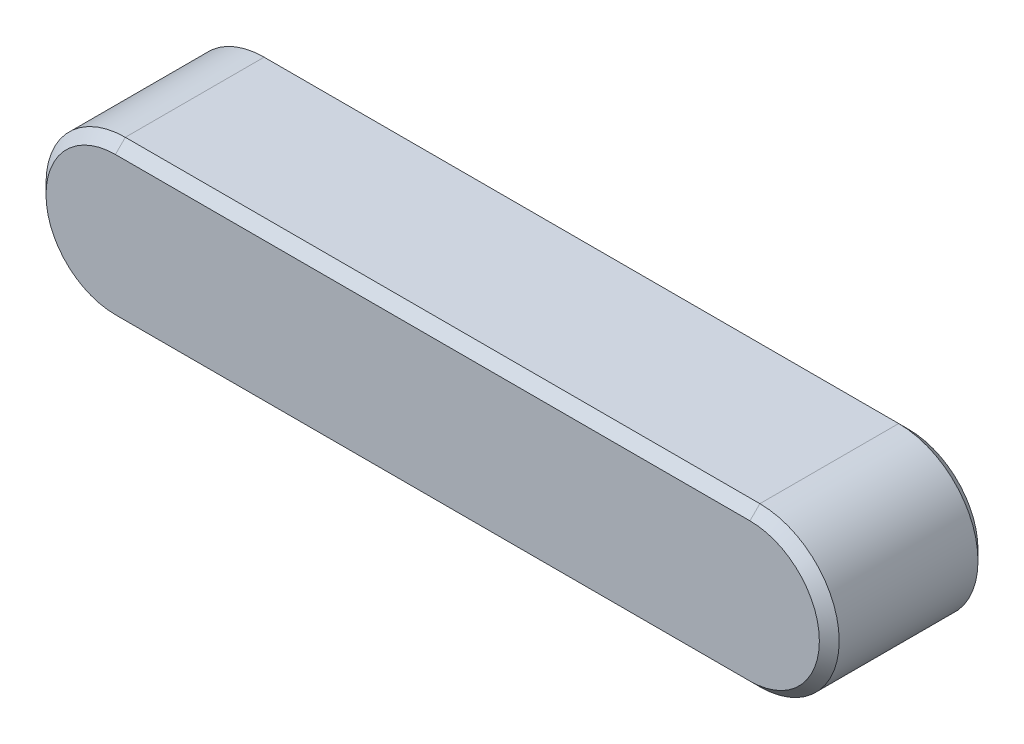
ISO-10303-21;
HEADER;
FILE_DESCRIPTION(('STEP AP214'),'2;1');
FILE_NAME('part.step','',(''),(''),'','','');
FILE_SCHEMA(('AUTOMOTIVE_DESIGN { 1 0 10303 214 1 1 1 1 }'));
ENDSEC;
DATA;
#1=APPLICATION_CONTEXT('core data for automotive mechanical design processes');
#2=APPLICATION_PROTOCOL_DEFINITION('international standard','automotive_design',2000,#1);
#3=PRODUCT_CONTEXT('',#1,'mechanical');
#4=PRODUCT('Part','Part','',(#3));
#5=PRODUCT_RELATED_PRODUCT_CATEGORY('part','',(#4));
#6=PRODUCT_DEFINITION_FORMATION('','',#4);
#7=PRODUCT_DEFINITION_CONTEXT('part definition',#1,'design');
#8=PRODUCT_DEFINITION('design','',#6,#7);
#9=PRODUCT_DEFINITION_SHAPE('','',#8);
#10=(LENGTH_UNIT() NAMED_UNIT(*) SI_UNIT(.MILLI.,.METRE.));
#11=(NAMED_UNIT(*) PLANE_ANGLE_UNIT() SI_UNIT($,.RADIAN.));
#12=(NAMED_UNIT(*) SI_UNIT($,.STERADIAN.) SOLID_ANGLE_UNIT());
#13=UNCERTAINTY_MEASURE_WITH_UNIT(LENGTH_MEASURE(1.E-05),#10,'distance_accuracy_value','');
#14=(GEOMETRIC_REPRESENTATION_CONTEXT(3) GLOBAL_UNCERTAINTY_ASSIGNED_CONTEXT((#13)) GLOBAL_UNIT_ASSIGNED_CONTEXT((#10,
#11,#12)) REPRESENTATION_CONTEXT('',''));
#15=CARTESIAN_POINT('',(0.,0.,0.));
#16=DIRECTION('',(0.,0.,1.));
#17=DIRECTION('',(1.,0.,0.));
#18=AXIS2_PLACEMENT_3D('',#15,#16,#17);
#19=CARTESIAN_POINT('',(-16.,0.,2.));
#20=DIRECTION('',(0.,0.,-1.));
#21=DIRECTION('',(-1.,0.,0.));
#22=AXIS2_PLACEMENT_3D('',#19,#20,#21);
#23=CYLINDRICAL_SURFACE('',#22,2.);
#24=DIRECTION('',(0.,0.,-1.));
#25=VECTOR('',#24,1.);
#26=CARTESIAN_POINT('',(-16.,-2.,2.));
#27=LINE('',#26,#25);
#28=CARTESIAN_POINT('',(-16.,-2.,1.75));
#29=VERTEX_POINT('',#28);
#30=CARTESIAN_POINT('',(-16.,-2.,-1.75));
#31=VERTEX_POINT('',#30);
#32=EDGE_CURVE('E120',#29,#31,#27,.T.);
#33=ORIENTED_EDGE('',*,*,#32,.F.);
#34=CARTESIAN_POINT('',(-16.,0.,1.75));
#35=DIRECTION('',(0.,0.,-1.));
#36=DIRECTION('',(-1.,0.,0.));
#37=AXIS2_PLACEMENT_3D('',#34,#35,#36);
#38=CIRCLE('',#37,2.);
#39=CARTESIAN_POINT('',(-16.,2.,1.75));
#40=VERTEX_POINT('',#39);
#41=EDGE_CURVE('E54',#29,#40,#38,.T.);
#42=ORIENTED_EDGE('',*,*,#41,.T.);
#43=DIRECTION('',(0.,0.,-1.));
#44=VECTOR('',#43,1.);
#45=CARTESIAN_POINT('',(-16.,2.,2.));
#46=LINE('',#45,#44);
#47=CARTESIAN_POINT('',(-16.,2.,-1.75));
#48=VERTEX_POINT('',#47);
#49=EDGE_CURVE('E158',#40,#48,#46,.T.);
#50=ORIENTED_EDGE('',*,*,#49,.T.);
#51=CARTESIAN_POINT('',(-16.,0.,-1.75));
#52=DIRECTION('',(0.,0.,-1.));
#53=DIRECTION('',(-1.,0.,0.));
#54=AXIS2_PLACEMENT_3D('',#51,#52,#53);
#55=CIRCLE('',#54,2.);
#56=EDGE_CURVE('E108',#48,#31,#55,.F.);
#57=ORIENTED_EDGE('',*,*,#56,.T.);
#58=EDGE_LOOP('',(#33,#42,#50,#57));
#59=FACE_BOUND('',#58,.T.);
#60=ADVANCED_FACE('F31',(#59),#23,.T.);
#61=CARTESIAN_POINT('',(0.,-2.,2.));
#62=DIRECTION('',(0.,1.,0.));
#63=DIRECTION('',(-1.,0.,0.));
#64=AXIS2_PLACEMENT_3D('',#61,#62,#63);
#65=PLANE('',#64);
#66=ORIENTED_EDGE('',*,*,#32,.T.);
#67=DIRECTION('',(1.,0.,0.));
#68=VECTOR('',#67,1.);
#69=CARTESIAN_POINT('',(0.,-2.,-1.75));
#70=LINE('',#69,#68);
#71=CARTESIAN_POINT('',(0.,-2.,-1.75));
#72=VERTEX_POINT('',#71);
#73=EDGE_CURVE('E119',#31,#72,#70,.T.);
#74=ORIENTED_EDGE('',*,*,#73,.T.);
#75=DIRECTION('',(0.,0.,-1.));
#76=VECTOR('',#75,1.);
#77=CARTESIAN_POINT('',(0.,-2.,2.));
#78=LINE('',#77,#76);
#79=CARTESIAN_POINT('',(0.,-2.,1.75));
#80=VERTEX_POINT('',#79);
#81=EDGE_CURVE('E102',#80,#72,#78,.T.);
#82=ORIENTED_EDGE('',*,*,#81,.F.);
#83=DIRECTION('',(-1.,0.,0.));
#84=VECTOR('',#83,1.);
#85=CARTESIAN_POINT('',(0.,-2.,1.74999999999999));
#86=LINE('',#85,#84);
#87=EDGE_CURVE('E117',#80,#29,#86,.T.);
#88=ORIENTED_EDGE('',*,*,#87,.T.);
#89=EDGE_LOOP('',(#66,#74,#82,#88));
#90=FACE_BOUND('',#89,.T.);
#91=ADVANCED_FACE('F116',(#90),#65,.F.);
#92=CARTESIAN_POINT('',(0.,0.,2.));
#93=DIRECTION('',(0.,0.,-1.));
#94=DIRECTION('',(-1.,0.,0.));
#95=AXIS2_PLACEMENT_3D('',#92,#93,#94);
#96=CYLINDRICAL_SURFACE('',#95,2.);
#97=DIRECTION('',(0.,0.,-1.));
#98=VECTOR('',#97,1.);
#99=CARTESIAN_POINT('',(0.,2.,2.));
#100=LINE('',#99,#98);
#101=CARTESIAN_POINT('',(0.,2.,1.75));
#102=VERTEX_POINT('',#101);
#103=CARTESIAN_POINT('',(0.,2.,-1.75));
#104=VERTEX_POINT('',#103);
#105=EDGE_CURVE('E103',#102,#104,#100,.T.);
#106=ORIENTED_EDGE('',*,*,#105,.F.);
#107=CARTESIAN_POINT('',(0.,0.,1.75));
#108=DIRECTION('',(0.,0.,-1.));
#109=DIRECTION('',(-1.,0.,0.));
#110=AXIS2_PLACEMENT_3D('',#107,#108,#109);
#111=CIRCLE('',#110,2.);
#112=EDGE_CURVE('E99',#102,#80,#111,.T.);
#113=ORIENTED_EDGE('',*,*,#112,.T.);
#114=ORIENTED_EDGE('',*,*,#81,.T.);
#115=CARTESIAN_POINT('',(0.,0.,-1.75));
#116=DIRECTION('',(0.,0.,-1.));
#117=DIRECTION('',(-1.,0.,0.));
#118=AXIS2_PLACEMENT_3D('',#115,#116,#117);
#119=CIRCLE('',#118,2.);
#120=EDGE_CURVE('E109',#72,#104,#119,.F.);
#121=ORIENTED_EDGE('',*,*,#120,.T.);
#122=EDGE_LOOP('',(#106,#113,#114,#121));
#123=FACE_BOUND('',#122,.T.);
#124=ADVANCED_FACE('F101',(#123),#96,.T.);
#125=CARTESIAN_POINT('',(-16.,2.,2.));
#126=DIRECTION('',(0.,-1.,0.));
#127=DIRECTION('',(0.,0.,-1.));
#128=AXIS2_PLACEMENT_3D('',#125,#126,#127);
#129=PLANE('',#128);
#130=ORIENTED_EDGE('',*,*,#49,.F.);
#131=DIRECTION('',(1.,0.,0.));
#132=VECTOR('',#131,1.);
#133=CARTESIAN_POINT('',(-16.,2.,1.75));
#134=LINE('',#133,#132);
#135=EDGE_CURVE('E11',#40,#102,#134,.T.);
#136=ORIENTED_EDGE('',*,*,#135,.T.);
#137=ORIENTED_EDGE('',*,*,#105,.T.);
#138=DIRECTION('',(-1.,0.,0.));
#139=VECTOR('',#138,1.);
#140=CARTESIAN_POINT('',(-16.,2.,-1.75));
#141=LINE('',#140,#139);
#142=EDGE_CURVE('E40',#104,#48,#141,.T.);
#143=ORIENTED_EDGE('',*,*,#142,.T.);
#144=EDGE_LOOP('',(#130,#136,#137,#143));
#145=FACE_BOUND('',#144,.T.);
#146=ADVANCED_FACE('F208',(#145),#129,.F.);
#147=CARTESIAN_POINT('',(-16.,0.,2.));
#148=DIRECTION('',(0.,0.,-1.));
#149=DIRECTION('',(-1.,0.,0.));
#150=AXIS2_PLACEMENT_3D('',#147,#148,#149);
#151=PLANE('',#150);
#152=CARTESIAN_POINT('',(-16.,0.,2.));
#153=DIRECTION('',(0.,0.,-1.));
#154=DIRECTION('',(-1.,0.,0.));
#155=AXIS2_PLACEMENT_3D('',#152,#153,#154);
#156=CIRCLE('',#155,1.75);
#157=CARTESIAN_POINT('',(-16.,1.75,2.));
#158=VERTEX_POINT('',#157);
#159=CARTESIAN_POINT('',(-16.,-1.75,2.));
#160=VERTEX_POINT('',#159);
#161=EDGE_CURVE('E179',#158,#160,#156,.F.);
#162=ORIENTED_EDGE('',*,*,#161,.T.);
#163=DIRECTION('',(1.,0.,0.));
#164=VECTOR('',#163,1.);
#165=CARTESIAN_POINT('',(-16.,-1.75,2.));
#166=LINE('',#165,#164);
#167=CARTESIAN_POINT('',(0.,-1.75,2.));
#168=VERTEX_POINT('',#167);
#169=EDGE_CURVE('E182',#160,#168,#166,.T.);
#170=ORIENTED_EDGE('',*,*,#169,.T.);
#171=CARTESIAN_POINT('',(0.,0.,2.));
#172=DIRECTION('',(0.,0.,-1.));
#173=DIRECTION('',(-1.,0.,0.));
#174=AXIS2_PLACEMENT_3D('',#171,#172,#173);
#175=CIRCLE('',#174,1.75);
#176=CARTESIAN_POINT('',(0.,1.75,2.));
#177=VERTEX_POINT('',#176);
#178=EDGE_CURVE('E131',#168,#177,#175,.F.);
#179=ORIENTED_EDGE('',*,*,#178,.T.);
#180=DIRECTION('',(-1.,0.,0.));
#181=VECTOR('',#180,1.);
#182=CARTESIAN_POINT('',(-16.,1.75,2.));
#183=LINE('',#182,#181);
#184=EDGE_CURVE('E177',#177,#158,#183,.T.);
#185=ORIENTED_EDGE('',*,*,#184,.T.);
#186=EDGE_LOOP('',(#162,#170,#179,#185));
#187=FACE_BOUND('',#186,.T.);
#188=ADVANCED_FACE('F211',(#187),#151,.F.);
#189=CARTESIAN_POINT('',(-16.,0.,-2.));
#190=DIRECTION('',(0.,0.,-1.));
#191=DIRECTION('',(-1.,0.,0.));
#192=AXIS2_PLACEMENT_3D('',#189,#190,#191);
#193=PLANE('',#192);
#194=CARTESIAN_POINT('',(0.,0.,-2.));
#195=DIRECTION('',(0.,0.,-1.));
#196=DIRECTION('',(-1.,0.,0.));
#197=AXIS2_PLACEMENT_3D('',#194,#195,#196);
#198=CIRCLE('',#197,1.75);
#199=CARTESIAN_POINT('',(0.,1.75,-2.));
#200=VERTEX_POINT('',#199);
#201=CARTESIAN_POINT('',(0.,-1.75,-2.));
#202=VERTEX_POINT('',#201);
#203=EDGE_CURVE('E172',#200,#202,#198,.T.);
#204=ORIENTED_EDGE('',*,*,#203,.T.);
#205=DIRECTION('',(-1.,0.,0.));
#206=VECTOR('',#205,1.);
#207=CARTESIAN_POINT('',(-16.,-1.75,-2.));
#208=LINE('',#207,#206);
#209=CARTESIAN_POINT('',(-16.,-1.75,-2.));
#210=VERTEX_POINT('',#209);
#211=EDGE_CURVE('E174',#202,#210,#208,.T.);
#212=ORIENTED_EDGE('',*,*,#211,.T.);
#213=CARTESIAN_POINT('',(-16.,0.,-2.));
#214=DIRECTION('',(0.,0.,-1.));
#215=DIRECTION('',(-1.,0.,0.));
#216=AXIS2_PLACEMENT_3D('',#213,#214,#215);
#217=CIRCLE('',#216,1.75);
#218=CARTESIAN_POINT('',(-16.,1.75,-2.));
#219=VERTEX_POINT('',#218);
#220=EDGE_CURVE('E170',#210,#219,#217,.T.);
#221=ORIENTED_EDGE('',*,*,#220,.T.);
#222=DIRECTION('',(1.,0.,0.));
#223=VECTOR('',#222,1.);
#224=CARTESIAN_POINT('',(0.,1.75,-2.));
#225=LINE('',#224,#223);
#226=EDGE_CURVE('E168',#219,#200,#225,.T.);
#227=ORIENTED_EDGE('',*,*,#226,.T.);
#228=EDGE_LOOP('',(#204,#212,#221,#227));
#229=FACE_BOUND('',#228,.T.);
#230=ADVANCED_FACE('F212',(#229),#193,.T.);
#231=CARTESIAN_POINT('',(-16.,2.,-1.75));
#232=DIRECTION('',(0.,0.707106781186547,-0.707106781186547));
#233=DIRECTION('',(0.,0.707106781186548,0.707106781186548));
#234=AXIS2_PLACEMENT_3D('',#231,#232,#233);
#235=PLANE('',#234);
#236=DIRECTION('',(0.,0.707106781186547,0.707106781186547));
#237=VECTOR('',#236,1.);
#238=CARTESIAN_POINT('',(0.,1.75,-2.));
#239=LINE('',#238,#237);
#240=EDGE_CURVE('E150',#200,#104,#239,.T.);
#241=ORIENTED_EDGE('',*,*,#240,.F.);
#242=ORIENTED_EDGE('',*,*,#226,.F.);
#243=DIRECTION('',(0.,-0.707106781186547,-0.707106781186547));
#244=VECTOR('',#243,1.);
#245=CARTESIAN_POINT('',(-16.,2.,-1.75));
#246=LINE('',#245,#244);
#247=EDGE_CURVE('E137',#48,#219,#246,.T.);
#248=ORIENTED_EDGE('',*,*,#247,.F.);
#249=ORIENTED_EDGE('',*,*,#142,.F.);
#250=EDGE_LOOP('',(#241,#242,#248,#249));
#251=FACE_BOUND('',#250,.T.);
#252=ADVANCED_FACE('F215',(#251),#235,.T.);
#253=CARTESIAN_POINT('',(-16.,0.,-1.75));
#254=DIRECTION('',(0.,0.,1.));
#255=DIRECTION('',(1.,0.,0.));
#256=AXIS2_PLACEMENT_3D('',#253,#254,#255);
#257=CONICAL_SURFACE('',#256,2.,0.785398163397448);
#258=ORIENTED_EDGE('',*,*,#247,.T.);
#259=ORIENTED_EDGE('',*,*,#220,.F.);
#260=DIRECTION('',(0.,0.707106781186547,-0.707106781186547));
#261=VECTOR('',#260,1.);
#262=CARTESIAN_POINT('',(-16.,-2.,-1.75));
#263=LINE('',#262,#261);
#264=EDGE_CURVE('E144',#31,#210,#263,.T.);
#265=ORIENTED_EDGE('',*,*,#264,.F.);
#266=ORIENTED_EDGE('',*,*,#56,.F.);
#267=EDGE_LOOP('',(#258,#259,#265,#266));
#268=FACE_BOUND('',#267,.T.);
#269=ADVANCED_FACE('F187',(#268),#257,.T.);
#270=CARTESIAN_POINT('',(0.,0.,-1.75));
#271=DIRECTION('',(0.,0.,1.));
#272=DIRECTION('',(1.,0.,0.));
#273=AXIS2_PLACEMENT_3D('',#270,#271,#272);
#274=CONICAL_SURFACE('',#273,2.,0.785398163397448);
#275=ORIENTED_EDGE('',*,*,#240,.T.);
#276=ORIENTED_EDGE('',*,*,#120,.F.);
#277=DIRECTION('',(0.,-0.707106781186547,0.707106781186547));
#278=VECTOR('',#277,1.);
#279=CARTESIAN_POINT('',(0.,-1.75,-2.));
#280=LINE('',#279,#278);
#281=EDGE_CURVE('E140',#202,#72,#280,.T.);
#282=ORIENTED_EDGE('',*,*,#281,.F.);
#283=ORIENTED_EDGE('',*,*,#203,.F.);
#284=EDGE_LOOP('',(#275,#276,#282,#283));
#285=FACE_BOUND('',#284,.T.);
#286=ADVANCED_FACE('F190',(#285),#274,.T.);
#287=CARTESIAN_POINT('',(0.,-2.,-1.75));
#288=DIRECTION('',(0.,-0.707106781186547,-0.707106781186547));
#289=DIRECTION('',(0.,0.707106781186548,-0.707106781186548));
#290=AXIS2_PLACEMENT_3D('',#287,#288,#289);
#291=PLANE('',#290);
#292=ORIENTED_EDGE('',*,*,#264,.T.);
#293=ORIENTED_EDGE('',*,*,#211,.F.);
#294=ORIENTED_EDGE('',*,*,#281,.T.);
#295=ORIENTED_EDGE('',*,*,#73,.F.);
#296=EDGE_LOOP('',(#292,#293,#294,#295));
#297=FACE_BOUND('',#296,.T.);
#298=ADVANCED_FACE('F188',(#297),#291,.T.);
#299=CARTESIAN_POINT('',(-16.,1.75,2.));
#300=DIRECTION('',(0.,-0.707106781186547,-0.707106781186547));
#301=DIRECTION('',(0.,0.707106781186548,-0.707106781186548));
#302=AXIS2_PLACEMENT_3D('',#299,#300,#301);
#303=PLANE('',#302);
#304=DIRECTION('',(0.,-0.707106781186547,0.707106781186547));
#305=VECTOR('',#304,1.);
#306=CARTESIAN_POINT('',(0.,2.,1.75));
#307=LINE('',#306,#305);
#308=EDGE_CURVE('E134',#102,#177,#307,.T.);
#309=ORIENTED_EDGE('',*,*,#308,.F.);
#310=ORIENTED_EDGE('',*,*,#135,.F.);
#311=DIRECTION('',(0.,0.707106781186547,-0.707106781186547));
#312=VECTOR('',#311,1.);
#313=CARTESIAN_POINT('',(-16.,1.75,2.));
#314=LINE('',#313,#312);
#315=EDGE_CURVE('E35',#158,#40,#314,.T.);
#316=ORIENTED_EDGE('',*,*,#315,.F.);
#317=ORIENTED_EDGE('',*,*,#184,.F.);
#318=EDGE_LOOP('',(#309,#310,#316,#317));
#319=FACE_BOUND('',#318,.T.);
#320=ADVANCED_FACE('F33',(#319),#303,.F.);
#321=CARTESIAN_POINT('',(-16.,0.,2.));
#322=DIRECTION('',(0.,0.,-1.));
#323=DIRECTION('',(-1.,0.,0.));
#324=AXIS2_PLACEMENT_3D('',#321,#322,#323);
#325=CONICAL_SURFACE('',#324,1.75,0.785398163397448);
#326=ORIENTED_EDGE('',*,*,#315,.T.);
#327=ORIENTED_EDGE('',*,*,#41,.F.);
#328=DIRECTION('',(0.,-0.707106781186547,-0.707106781186547));
#329=VECTOR('',#328,1.);
#330=CARTESIAN_POINT('',(-16.,-1.75,2.));
#331=LINE('',#330,#329);
#332=EDGE_CURVE('E128',#160,#29,#331,.T.);
#333=ORIENTED_EDGE('',*,*,#332,.F.);
#334=ORIENTED_EDGE('',*,*,#161,.F.);
#335=EDGE_LOOP('',(#326,#327,#333,#334));
#336=FACE_BOUND('',#335,.T.);
#337=ADVANCED_FACE('F196',(#336),#325,.T.);
#338=CARTESIAN_POINT('',(0.,0.,2.));
#339=DIRECTION('',(0.,0.,-1.));
#340=DIRECTION('',(-1.,0.,0.));
#341=AXIS2_PLACEMENT_3D('',#338,#339,#340);
#342=CONICAL_SURFACE('',#341,1.75,0.785398163397448);
#343=ORIENTED_EDGE('',*,*,#308,.T.);
#344=ORIENTED_EDGE('',*,*,#178,.F.);
#345=DIRECTION('',(0.,0.707106781186547,0.707106781186547));
#346=VECTOR('',#345,1.);
#347=CARTESIAN_POINT('',(0.,-2.,1.75));
#348=LINE('',#347,#346);
#349=EDGE_CURVE('E125',#80,#168,#348,.T.);
#350=ORIENTED_EDGE('',*,*,#349,.F.);
#351=ORIENTED_EDGE('',*,*,#112,.F.);
#352=EDGE_LOOP('',(#343,#344,#350,#351));
#353=FACE_BOUND('',#352,.T.);
#354=ADVANCED_FACE('F130',(#353),#342,.T.);
#355=CARTESIAN_POINT('',(-16.,-1.75,2.));
#356=DIRECTION('',(0.,0.70710678118655,-0.707106781186545));
#357=DIRECTION('',(0.,0.707106781186545,0.70710678118655));
#358=AXIS2_PLACEMENT_3D('',#355,#356,#357);
#359=PLANE('',#358);
#360=ORIENTED_EDGE('',*,*,#332,.T.);
#361=ORIENTED_EDGE('',*,*,#87,.F.);
#362=ORIENTED_EDGE('',*,*,#349,.T.);
#363=ORIENTED_EDGE('',*,*,#169,.F.);
#364=EDGE_LOOP('',(#360,#361,#362,#363));
#365=FACE_BOUND('',#364,.T.);
#366=ADVANCED_FACE('F123',(#365),#359,.F.);
#367=CLOSED_SHELL('',(#60,#91,#124,#146,#188,#230,#252,#269,#286,#298,#320,#337,#354,#366));
#368=MANIFOLD_SOLID_BREP('B2',#367);
#369=ADVANCED_BREP_SHAPE_REPRESENTATION('',(#18,#368),#14);
#370=SHAPE_DEFINITION_REPRESENTATION(#9,#369);
ENDSEC;
END-ISO-10303-21;
